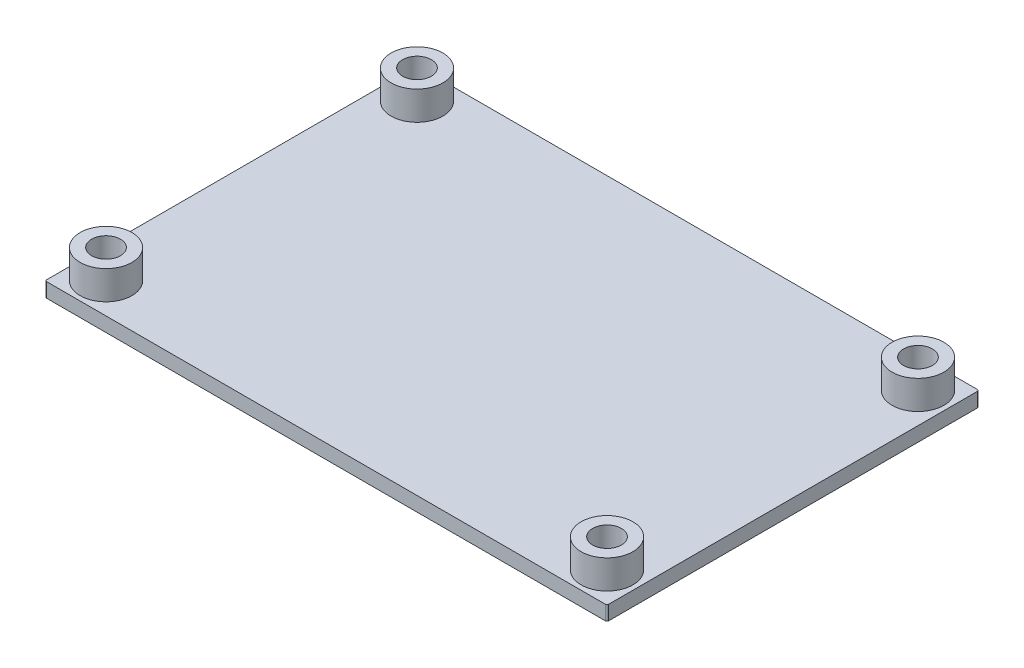
ISO-10303-21;
HEADER;
FILE_DESCRIPTION(('STEP AP214'),'2;1');
FILE_NAME('part.step','',(''),(''),'','','');
FILE_SCHEMA(('AUTOMOTIVE_DESIGN { 1 0 10303 214 1 1 1 1 }'));
ENDSEC;
DATA;
#1=APPLICATION_CONTEXT('core data for automotive mechanical design processes');
#2=APPLICATION_PROTOCOL_DEFINITION('international standard','automotive_design',2000,#1);
#3=PRODUCT_CONTEXT('',#1,'mechanical');
#4=PRODUCT('Part','Part','',(#3));
#5=PRODUCT_RELATED_PRODUCT_CATEGORY('part','',(#4));
#6=PRODUCT_DEFINITION_FORMATION('','',#4);
#7=PRODUCT_DEFINITION_CONTEXT('part definition',#1,'design');
#8=PRODUCT_DEFINITION('design','',#6,#7);
#9=PRODUCT_DEFINITION_SHAPE('','',#8);
#10=(LENGTH_UNIT() NAMED_UNIT(*) SI_UNIT(.MILLI.,.METRE.));
#11=(NAMED_UNIT(*) PLANE_ANGLE_UNIT() SI_UNIT($,.RADIAN.));
#12=(NAMED_UNIT(*) SI_UNIT($,.STERADIAN.) SOLID_ANGLE_UNIT());
#13=UNCERTAINTY_MEASURE_WITH_UNIT(LENGTH_MEASURE(1.E-05),#10,'distance_accuracy_value','');
#14=(GEOMETRIC_REPRESENTATION_CONTEXT(3) GLOBAL_UNCERTAINTY_ASSIGNED_CONTEXT((#13)) GLOBAL_UNIT_ASSIGNED_CONTEXT((#10,
#11,#12)) REPRESENTATION_CONTEXT('',''));
#15=CARTESIAN_POINT('',(0.,0.,0.));
#16=DIRECTION('',(0.,0.,1.));
#17=DIRECTION('',(1.,0.,0.));
#18=AXIS2_PLACEMENT_3D('',#15,#16,#17);
#19=CARTESIAN_POINT('',(8.00000000000001,7.5,-8.));
#20=DIRECTION('',(0.,-1.,0.));
#21=DIRECTION('',(0.,0.,-1.));
#22=AXIS2_PLACEMENT_3D('',#19,#20,#21);
#23=CYLINDRICAL_SURFACE('',#22,4.5);
#24=CARTESIAN_POINT('',(8.00000000000001,2.5,-8.));
#25=DIRECTION('',(0.,1.,0.));
#26=DIRECTION('',(0.,0.,1.));
#27=AXIS2_PLACEMENT_3D('',#24,#25,#26);
#28=CIRCLE('',#27,4.5);
#29=CARTESIAN_POINT('',(8.00000000000001,2.5,-3.5));
#30=VERTEX_POINT('',#29);
#31=EDGE_CURVE('E309',#30,#30,#28,.F.);
#32=ORIENTED_EDGE('',*,*,#31,.F.);
#33=EDGE_LOOP('',(#32));
#34=FACE_BOUND('',#33,.T.);
#35=CARTESIAN_POINT('',(8.00000000000001,7.5,-8.));
#36=DIRECTION('',(0.,1.,0.));
#37=DIRECTION('',(0.,0.,1.));
#38=AXIS2_PLACEMENT_3D('',#35,#36,#37);
#39=CIRCLE('',#38,4.5);
#40=CARTESIAN_POINT('',(8.00000000000001,7.5,-3.5));
#41=VERTEX_POINT('',#40);
#42=EDGE_CURVE('E301',#41,#41,#39,.F.);
#43=ORIENTED_EDGE('',*,*,#42,.T.);
#44=EDGE_LOOP('',(#43));
#45=FACE_BOUND('',#44,.T.);
#46=ADVANCED_FACE('F149',(#34,#45),#23,.T.);
#47=CARTESIAN_POINT('',(8.00000000000001,7.5,-8.));
#48=DIRECTION('',(0.,-1.,0.));
#49=DIRECTION('',(0.,0.,-1.));
#50=AXIS2_PLACEMENT_3D('',#47,#48,#49);
#51=CYLINDRICAL_SURFACE('',#50,2.5);
#52=CARTESIAN_POINT('',(8.00000000000001,2.5,-8.));
#53=DIRECTION('',(0.,1.,0.));
#54=DIRECTION('',(0.,0.,1.));
#55=AXIS2_PLACEMENT_3D('',#52,#53,#54);
#56=CIRCLE('',#55,2.5);
#57=CARTESIAN_POINT('',(8.00000000000001,2.5,-5.50000000000001));
#58=VERTEX_POINT('',#57);
#59=EDGE_CURVE('E330',#58,#58,#56,.F.);
#60=ORIENTED_EDGE('',*,*,#59,.T.);
#61=EDGE_LOOP('',(#60));
#62=FACE_BOUND('',#61,.T.);
#63=CARTESIAN_POINT('',(8.00000000000001,7.5,-8.));
#64=DIRECTION('',(0.,1.,0.));
#65=DIRECTION('',(0.,0.,1.));
#66=AXIS2_PLACEMENT_3D('',#63,#64,#65);
#67=CIRCLE('',#66,2.5);
#68=CARTESIAN_POINT('',(8.00000000000001,7.5,-5.50000000000001));
#69=VERTEX_POINT('',#68);
#70=EDGE_CURVE('E305',#69,#69,#67,.F.);
#71=ORIENTED_EDGE('',*,*,#70,.F.);
#72=EDGE_LOOP('',(#71));
#73=FACE_BOUND('',#72,.T.);
#74=ADVANCED_FACE('F397',(#62,#73),#51,.F.);
#75=CARTESIAN_POINT('',(0.,7.5,0.));
#76=DIRECTION('',(0.,1.,0.));
#77=DIRECTION('',(0.,0.,1.));
#78=AXIS2_PLACEMENT_3D('',#75,#76,#77);
#79=PLANE('',#78);
#80=ORIENTED_EDGE('',*,*,#42,.F.);
#81=EDGE_LOOP('',(#80));
#82=FACE_BOUND('',#81,.T.);
#83=ORIENTED_EDGE('',*,*,#70,.T.);
#84=EDGE_LOOP('',(#83));
#85=FACE_BOUND('',#84,.T.);
#86=ADVANCED_FACE('F402',(#82,#85),#79,.T.);
#87=CARTESIAN_POINT('',(0.,0.,0.));
#88=DIRECTION('',(0.,1.,0.));
#89=DIRECTION('',(0.,0.,1.));
#90=AXIS2_PLACEMENT_3D('',#87,#88,#89);
#91=PLANE('',#90);
#92=DIRECTION('',(1.,0.,0.));
#93=VECTOR('',#92,1.);
#94=CARTESIAN_POINT('',(0.,0.,-2.7));
#95=LINE('',#94,#93);
#96=CARTESIAN_POINT('',(3.,0.,-2.7));
#97=VERTEX_POINT('',#96);
#98=CARTESIAN_POINT('',(100.,0.,-2.7));
#99=VERTEX_POINT('',#98);
#100=EDGE_CURVE('E253',#97,#99,#95,.T.);
#101=ORIENTED_EDGE('',*,*,#100,.F.);
#102=CARTESIAN_POINT('',(3.,0.,-3.));
#103=DIRECTION('',(0.,1.,0.));
#104=DIRECTION('',(0.,0.,1.));
#105=AXIS2_PLACEMENT_3D('',#102,#103,#104);
#106=CIRCLE('',#105,0.299999999999999);
#107=CARTESIAN_POINT('',(2.7,0.,-3.00000000000002));
#108=VERTEX_POINT('',#107);
#109=EDGE_CURVE('E277',#97,#108,#106,.F.);
#110=ORIENTED_EDGE('',*,*,#109,.T.);
#111=DIRECTION('',(0.,0.,-1.));
#112=VECTOR('',#111,1.);
#113=CARTESIAN_POINT('',(2.7,0.,0.));
#114=LINE('',#113,#112);
#115=CARTESIAN_POINT('',(2.7,0.,-67.));
#116=VERTEX_POINT('',#115);
#117=EDGE_CURVE('E274',#108,#116,#114,.T.);
#118=ORIENTED_EDGE('',*,*,#117,.T.);
#119=CARTESIAN_POINT('',(3.,0.,-67.));
#120=DIRECTION('',(0.,1.,0.));
#121=DIRECTION('',(0.,0.,1.));
#122=AXIS2_PLACEMENT_3D('',#119,#120,#121);
#123=CIRCLE('',#122,0.300000000000005);
#124=CARTESIAN_POINT('',(3.00000000000002,0.,-67.3));
#125=VERTEX_POINT('',#124);
#126=EDGE_CURVE('E226',#116,#125,#123,.F.);
#127=ORIENTED_EDGE('',*,*,#126,.T.);
#128=DIRECTION('',(1.,0.,0.));
#129=VECTOR('',#128,1.);
#130=CARTESIAN_POINT('',(0.,0.,-67.3));
#131=LINE('',#130,#129);
#132=CARTESIAN_POINT('',(100.,0.,-67.3));
#133=VERTEX_POINT('',#132);
#134=EDGE_CURVE('E268',#125,#133,#131,.T.);
#135=ORIENTED_EDGE('',*,*,#134,.T.);
#136=CARTESIAN_POINT('',(100.,0.,-67.));
#137=DIRECTION('',(0.,1.,0.));
#138=DIRECTION('',(0.,0.,1.));
#139=AXIS2_PLACEMENT_3D('',#136,#137,#138);
#140=CIRCLE('',#139,0.300000000000009);
#141=CARTESIAN_POINT('',(100.3,0.,-67.));
#142=VERTEX_POINT('',#141);
#143=EDGE_CURVE('E264',#133,#142,#140,.F.);
#144=ORIENTED_EDGE('',*,*,#143,.T.);
#145=DIRECTION('',(0.,0.,-1.));
#146=VECTOR('',#145,1.);
#147=CARTESIAN_POINT('',(100.3,0.,0.));
#148=LINE('',#147,#146);
#149=CARTESIAN_POINT('',(100.3,0.,-3.00000000000002));
#150=VERTEX_POINT('',#149);
#151=EDGE_CURVE('E260',#150,#142,#148,.T.);
#152=ORIENTED_EDGE('',*,*,#151,.F.);
#153=CARTESIAN_POINT('',(100.,0.,-3.));
#154=DIRECTION('',(0.,1.,0.));
#155=DIRECTION('',(0.,0.,1.));
#156=AXIS2_PLACEMENT_3D('',#153,#154,#155);
#157=CIRCLE('',#156,0.300000000000004);
#158=EDGE_CURVE('E256',#99,#150,#157,.T.);
#159=ORIENTED_EDGE('',*,*,#158,.F.);
#160=EDGE_LOOP('',(#101,#110,#118,#127,#135,#144,#152,#159));
#161=FACE_BOUND('',#160,.T.);
#162=ADVANCED_FACE('F384',(#161),#91,.F.);
#163=CARTESIAN_POINT('',(0.,2.5,-2.7));
#164=DIRECTION('',(0.,0.,-1.));
#165=DIRECTION('',(-1.,0.,0.));
#166=AXIS2_PLACEMENT_3D('',#163,#164,#165);
#167=PLANE('',#166);
#168=ORIENTED_EDGE('',*,*,#100,.T.);
#169=DIRECTION('',(0.,-1.,0.));
#170=VECTOR('',#169,1.);
#171=CARTESIAN_POINT('',(100.,2.5,-2.7));
#172=LINE('',#171,#170);
#173=CARTESIAN_POINT('',(100.,2.5,-2.7));
#174=VERTEX_POINT('',#173);
#175=EDGE_CURVE('E298',#174,#99,#172,.T.);
#176=ORIENTED_EDGE('',*,*,#175,.F.);
#177=DIRECTION('',(1.,0.,0.));
#178=VECTOR('',#177,1.);
#179=CARTESIAN_POINT('',(0.,2.5,-2.7));
#180=LINE('',#179,#178);
#181=CARTESIAN_POINT('',(3.,2.5,-2.7));
#182=VERTEX_POINT('',#181);
#183=EDGE_CURVE('E367',#182,#174,#180,.T.);
#184=ORIENTED_EDGE('',*,*,#183,.F.);
#185=DIRECTION('',(0.,-1.,0.));
#186=VECTOR('',#185,1.);
#187=CARTESIAN_POINT('',(3.,2.5,-2.7));
#188=LINE('',#187,#186);
#189=EDGE_CURVE('E166',#182,#97,#188,.T.);
#190=ORIENTED_EDGE('',*,*,#189,.T.);
#191=EDGE_LOOP('',(#168,#176,#184,#190));
#192=FACE_BOUND('',#191,.T.);
#193=ADVANCED_FACE('F416',(#192),#167,.F.);
#194=CARTESIAN_POINT('',(100.,2.5,-3.));
#195=DIRECTION('',(0.,-1.,0.));
#196=DIRECTION('',(0.,0.,-1.));
#197=AXIS2_PLACEMENT_3D('',#194,#195,#196);
#198=CYLINDRICAL_SURFACE('',#197,0.300000000000004);
#199=ORIENTED_EDGE('',*,*,#158,.T.);
#200=DIRECTION('',(0.,-1.,0.));
#201=VECTOR('',#200,1.);
#202=CARTESIAN_POINT('',(100.3,2.5,-3.00000000000002));
#203=LINE('',#202,#201);
#204=CARTESIAN_POINT('',(100.3,2.5,-3.00000000000002));
#205=VERTEX_POINT('',#204);
#206=EDGE_CURVE('E294',#205,#150,#203,.T.);
#207=ORIENTED_EDGE('',*,*,#206,.F.);
#208=CARTESIAN_POINT('',(100.,2.5,-3.));
#209=DIRECTION('',(0.,1.,0.));
#210=DIRECTION('',(0.,0.,1.));
#211=AXIS2_PLACEMENT_3D('',#208,#209,#210);
#212=CIRCLE('',#211,0.300000000000004);
#213=EDGE_CURVE('E205',#174,#205,#212,.T.);
#214=ORIENTED_EDGE('',*,*,#213,.F.);
#215=ORIENTED_EDGE('',*,*,#175,.T.);
#216=EDGE_LOOP('',(#199,#207,#214,#215));
#217=FACE_BOUND('',#216,.T.);
#218=ADVANCED_FACE('F421',(#217),#198,.T.);
#219=CARTESIAN_POINT('',(100.3,2.5,0.));
#220=DIRECTION('',(-1.,0.,0.));
#221=DIRECTION('',(0.,0.,1.));
#222=AXIS2_PLACEMENT_3D('',#219,#220,#221);
#223=PLANE('',#222);
#224=ORIENTED_EDGE('',*,*,#151,.T.);
#225=DIRECTION('',(0.,-1.,0.));
#226=VECTOR('',#225,1.);
#227=CARTESIAN_POINT('',(100.3,2.5,-67.));
#228=LINE('',#227,#226);
#229=CARTESIAN_POINT('',(100.3,2.5,-67.));
#230=VERTEX_POINT('',#229);
#231=EDGE_CURVE('E291',#230,#142,#228,.T.);
#232=ORIENTED_EDGE('',*,*,#231,.F.);
#233=DIRECTION('',(0.,0.,-1.));
#234=VECTOR('',#233,1.);
#235=CARTESIAN_POINT('',(100.3,2.5,0.));
#236=LINE('',#235,#234);
#237=EDGE_CURVE('E372',#205,#230,#236,.T.);
#238=ORIENTED_EDGE('',*,*,#237,.F.);
#239=ORIENTED_EDGE('',*,*,#206,.T.);
#240=EDGE_LOOP('',(#224,#232,#238,#239));
#241=FACE_BOUND('',#240,.T.);
#242=ADVANCED_FACE('F424',(#241),#223,.F.);
#243=CARTESIAN_POINT('',(100.,2.5,-67.));
#244=DIRECTION('',(0.,-1.,0.));
#245=DIRECTION('',(0.,0.,-1.));
#246=AXIS2_PLACEMENT_3D('',#243,#244,#245);
#247=CYLINDRICAL_SURFACE('',#246,0.300000000000009);
#248=ORIENTED_EDGE('',*,*,#143,.F.);
#249=DIRECTION('',(0.,-1.,0.));
#250=VECTOR('',#249,1.);
#251=CARTESIAN_POINT('',(100.,2.5,-67.3));
#252=LINE('',#251,#250);
#253=CARTESIAN_POINT('',(100.,2.5,-67.3));
#254=VERTEX_POINT('',#253);
#255=EDGE_CURVE('E288',#254,#133,#252,.T.);
#256=ORIENTED_EDGE('',*,*,#255,.F.);
#257=CARTESIAN_POINT('',(100.,2.5,-67.));
#258=DIRECTION('',(0.,1.,0.));
#259=DIRECTION('',(0.,0.,1.));
#260=AXIS2_PLACEMENT_3D('',#257,#258,#259);
#261=CIRCLE('',#260,0.300000000000009);
#262=EDGE_CURVE('E375',#254,#230,#261,.F.);
#263=ORIENTED_EDGE('',*,*,#262,.T.);
#264=ORIENTED_EDGE('',*,*,#231,.T.);
#265=EDGE_LOOP('',(#248,#256,#263,#264));
#266=FACE_BOUND('',#265,.T.);
#267=ADVANCED_FACE('F427',(#266),#247,.T.);
#268=CARTESIAN_POINT('',(0.,2.5,-67.3));
#269=DIRECTION('',(0.,0.,-1.));
#270=DIRECTION('',(-1.,0.,0.));
#271=AXIS2_PLACEMENT_3D('',#268,#269,#270);
#272=PLANE('',#271);
#273=ORIENTED_EDGE('',*,*,#134,.F.);
#274=DIRECTION('',(0.,-1.,0.));
#275=VECTOR('',#274,1.);
#276=CARTESIAN_POINT('',(3.00000000000002,2.5,-67.3));
#277=LINE('',#276,#275);
#278=CARTESIAN_POINT('',(3.00000000000002,2.5,-67.3));
#279=VERTEX_POINT('',#278);
#280=EDGE_CURVE('E231',#279,#125,#277,.T.);
#281=ORIENTED_EDGE('',*,*,#280,.F.);
#282=DIRECTION('',(1.,0.,0.));
#283=VECTOR('',#282,1.);
#284=CARTESIAN_POINT('',(0.,2.5,-67.3));
#285=LINE('',#284,#283);
#286=EDGE_CURVE('E242',#279,#254,#285,.T.);
#287=ORIENTED_EDGE('',*,*,#286,.T.);
#288=ORIENTED_EDGE('',*,*,#255,.T.);
#289=EDGE_LOOP('',(#273,#281,#287,#288));
#290=FACE_BOUND('',#289,.T.);
#291=ADVANCED_FACE('F381',(#290),#272,.T.);
#292=CARTESIAN_POINT('',(3.,2.5,-67.));
#293=DIRECTION('',(0.,-1.,0.));
#294=DIRECTION('',(0.,0.,-1.));
#295=AXIS2_PLACEMENT_3D('',#292,#293,#294);
#296=CYLINDRICAL_SURFACE('',#295,0.300000000000005);
#297=ORIENTED_EDGE('',*,*,#126,.F.);
#298=DIRECTION('',(0.,-1.,0.));
#299=VECTOR('',#298,1.);
#300=CARTESIAN_POINT('',(2.7,2.5,-67.));
#301=LINE('',#300,#299);
#302=CARTESIAN_POINT('',(2.7,2.5,-67.));
#303=VERTEX_POINT('',#302);
#304=EDGE_CURVE('E221',#303,#116,#301,.T.);
#305=ORIENTED_EDGE('',*,*,#304,.F.);
#306=CARTESIAN_POINT('',(3.,2.5,-67.));
#307=DIRECTION('',(0.,1.,0.));
#308=DIRECTION('',(0.,0.,1.));
#309=AXIS2_PLACEMENT_3D('',#306,#307,#308);
#310=CIRCLE('',#309,0.300000000000005);
#311=EDGE_CURVE('E224',#303,#279,#310,.F.);
#312=ORIENTED_EDGE('',*,*,#311,.T.);
#313=ORIENTED_EDGE('',*,*,#280,.T.);
#314=EDGE_LOOP('',(#297,#305,#312,#313));
#315=FACE_BOUND('',#314,.T.);
#316=ADVANCED_FACE('F223',(#315),#296,.T.);
#317=CARTESIAN_POINT('',(2.7,2.5,0.));
#318=DIRECTION('',(-1.,0.,0.));
#319=DIRECTION('',(0.,0.,1.));
#320=AXIS2_PLACEMENT_3D('',#317,#318,#319);
#321=PLANE('',#320);
#322=ORIENTED_EDGE('',*,*,#117,.F.);
#323=DIRECTION('',(0.,-1.,0.));
#324=VECTOR('',#323,1.);
#325=CARTESIAN_POINT('',(2.7,2.5,-3.00000000000002));
#326=LINE('',#325,#324);
#327=CARTESIAN_POINT('',(2.7,2.5,-3.00000000000002));
#328=VERTEX_POINT('',#327);
#329=EDGE_CURVE('E192',#328,#108,#326,.T.);
#330=ORIENTED_EDGE('',*,*,#329,.F.);
#331=DIRECTION('',(0.,0.,-1.));
#332=VECTOR('',#331,1.);
#333=CARTESIAN_POINT('',(2.7,2.5,0.));
#334=LINE('',#333,#332);
#335=EDGE_CURVE('E239',#328,#303,#334,.T.);
#336=ORIENTED_EDGE('',*,*,#335,.T.);
#337=ORIENTED_EDGE('',*,*,#304,.T.);
#338=EDGE_LOOP('',(#322,#330,#336,#337));
#339=FACE_BOUND('',#338,.T.);
#340=ADVANCED_FACE('F245',(#339),#321,.T.);
#341=CARTESIAN_POINT('',(3.,2.5,-3.));
#342=DIRECTION('',(0.,-1.,0.));
#343=DIRECTION('',(0.,0.,-1.));
#344=AXIS2_PLACEMENT_3D('',#341,#342,#343);
#345=CYLINDRICAL_SURFACE('',#344,0.299999999999999);
#346=ORIENTED_EDGE('',*,*,#109,.F.);
#347=ORIENTED_EDGE('',*,*,#189,.F.);
#348=CARTESIAN_POINT('',(3.,2.5,-3.));
#349=DIRECTION('',(0.,1.,0.));
#350=DIRECTION('',(0.,0.,1.));
#351=AXIS2_PLACEMENT_3D('',#348,#349,#350);
#352=CIRCLE('',#351,0.299999999999999);
#353=EDGE_CURVE('E247',#182,#328,#352,.F.);
#354=ORIENTED_EDGE('',*,*,#353,.T.);
#355=ORIENTED_EDGE('',*,*,#329,.T.);
#356=EDGE_LOOP('',(#346,#347,#354,#355));
#357=FACE_BOUND('',#356,.T.);
#358=ADVANCED_FACE('F385',(#357),#345,.T.);
#359=CARTESIAN_POINT('',(0.,2.5,0.));
#360=DIRECTION('',(0.,1.,0.));
#361=DIRECTION('',(0.,0.,1.));
#362=AXIS2_PLACEMENT_3D('',#359,#360,#361);
#363=PLANE('',#362);
#364=CARTESIAN_POINT('',(8.00000000000001,2.5,-62.));
#365=DIRECTION('',(0.,1.,0.));
#366=DIRECTION('',(0.,0.,1.));
#367=AXIS2_PLACEMENT_3D('',#364,#365,#366);
#368=CIRCLE('',#367,4.50000000000001);
#369=CARTESIAN_POINT('',(8.00000000000001,2.5,-57.5));
#370=VERTEX_POINT('',#369);
#371=EDGE_CURVE('E281',#370,#370,#368,.T.);
#372=ORIENTED_EDGE('',*,*,#371,.F.);
#373=EDGE_LOOP('',(#372));
#374=FACE_BOUND('',#373,.T.);
#375=CARTESIAN_POINT('',(95.,2.5,-8.));
#376=DIRECTION('',(0.,1.,0.));
#377=DIRECTION('',(0.,0.,1.));
#378=AXIS2_PLACEMENT_3D('',#375,#376,#377);
#379=CIRCLE('',#378,4.5);
#380=CARTESIAN_POINT('',(95.,2.5,-3.5));
#381=VERTEX_POINT('',#380);
#382=EDGE_CURVE('E363',#381,#381,#379,.T.);
#383=ORIENTED_EDGE('',*,*,#382,.F.);
#384=EDGE_LOOP('',(#383));
#385=FACE_BOUND('',#384,.T.);
#386=ORIENTED_EDGE('',*,*,#183,.T.);
#387=ORIENTED_EDGE('',*,*,#213,.T.);
#388=ORIENTED_EDGE('',*,*,#237,.T.);
#389=ORIENTED_EDGE('',*,*,#262,.F.);
#390=ORIENTED_EDGE('',*,*,#286,.F.);
#391=ORIENTED_EDGE('',*,*,#311,.F.);
#392=ORIENTED_EDGE('',*,*,#335,.F.);
#393=ORIENTED_EDGE('',*,*,#353,.F.);
#394=EDGE_LOOP('',(#386,#387,#388,#389,#390,#391,#392,#393));
#395=FACE_BOUND('',#394,.T.);
#396=CARTESIAN_POINT('',(95.,2.5,-62.));
#397=DIRECTION('',(0.,1.,0.));
#398=DIRECTION('',(0.,0.,1.));
#399=AXIS2_PLACEMENT_3D('',#396,#397,#398);
#400=CIRCLE('',#399,4.50000000000001);
#401=CARTESIAN_POINT('',(95.,2.5,-57.5));
#402=VERTEX_POINT('',#401);
#403=EDGE_CURVE('E349',#402,#402,#400,.T.);
#404=ORIENTED_EDGE('',*,*,#403,.F.);
#405=EDGE_LOOP('',(#404));
#406=FACE_BOUND('',#405,.T.);
#407=ORIENTED_EDGE('',*,*,#31,.T.);
#408=EDGE_LOOP('',(#407));
#409=FACE_BOUND('',#408,.T.);
#410=ADVANCED_FACE('F236',(#374,#385,#395,#406,#409),#363,.T.);
#411=CARTESIAN_POINT('',(95.,7.5,-8.));
#412=DIRECTION('',(0.,-1.,0.));
#413=DIRECTION('',(0.,0.,-1.));
#414=AXIS2_PLACEMENT_3D('',#411,#412,#413);
#415=CYLINDRICAL_SURFACE('',#414,2.5);
#416=CARTESIAN_POINT('',(95.,2.5,-8.));
#417=DIRECTION('',(0.,1.,0.));
#418=DIRECTION('',(0.,0.,1.));
#419=AXIS2_PLACEMENT_3D('',#416,#417,#418);
#420=CIRCLE('',#419,2.5);
#421=CARTESIAN_POINT('',(95.,2.5,-5.50000000000001));
#422=VERTEX_POINT('',#421);
#423=EDGE_CURVE('E12',#422,#422,#420,.T.);
#424=ORIENTED_EDGE('',*,*,#423,.F.);
#425=EDGE_LOOP('',(#424));
#426=FACE_BOUND('',#425,.T.);
#427=CARTESIAN_POINT('',(95.,7.5,-8.));
#428=DIRECTION('',(0.,1.,0.));
#429=DIRECTION('',(0.,0.,1.));
#430=AXIS2_PLACEMENT_3D('',#427,#428,#429);
#431=CIRCLE('',#430,2.5);
#432=CARTESIAN_POINT('',(95.,7.5,-5.50000000000001));
#433=VERTEX_POINT('',#432);
#434=EDGE_CURVE('E353',#433,#433,#431,.T.);
#435=ORIENTED_EDGE('',*,*,#434,.T.);
#436=EDGE_LOOP('',(#435));
#437=FACE_BOUND('',#436,.T.);
#438=ADVANCED_FACE('F392',(#426,#437),#415,.F.);
#439=CARTESIAN_POINT('',(95.,7.5,-8.));
#440=DIRECTION('',(0.,-1.,0.));
#441=DIRECTION('',(0.,0.,-1.));
#442=AXIS2_PLACEMENT_3D('',#439,#440,#441);
#443=CYLINDRICAL_SURFACE('',#442,4.5);
#444=ORIENTED_EDGE('',*,*,#382,.T.);
#445=EDGE_LOOP('',(#444));
#446=FACE_BOUND('',#445,.T.);
#447=CARTESIAN_POINT('',(95.,7.5,-8.));
#448=DIRECTION('',(0.,1.,0.));
#449=DIRECTION('',(0.,0.,1.));
#450=AXIS2_PLACEMENT_3D('',#447,#448,#449);
#451=CIRCLE('',#450,4.5);
#452=CARTESIAN_POINT('',(95.,7.5,-3.5));
#453=VERTEX_POINT('',#452);
#454=EDGE_CURVE('E257',#453,#453,#451,.T.);
#455=ORIENTED_EDGE('',*,*,#454,.F.);
#456=EDGE_LOOP('',(#455));
#457=FACE_BOUND('',#456,.T.);
#458=ADVANCED_FACE('F463',(#446,#457),#443,.T.);
#459=CARTESIAN_POINT('',(0.,7.5,0.));
#460=DIRECTION('',(0.,1.,0.));
#461=DIRECTION('',(0.,0.,1.));
#462=AXIS2_PLACEMENT_3D('',#459,#460,#461);
#463=PLANE('',#462);
#464=ORIENTED_EDGE('',*,*,#434,.F.);
#465=EDGE_LOOP('',(#464));
#466=FACE_BOUND('',#465,.T.);
#467=ORIENTED_EDGE('',*,*,#454,.T.);
#468=EDGE_LOOP('',(#467));
#469=FACE_BOUND('',#468,.T.);
#470=ADVANCED_FACE('F474',(#466,#469),#463,.T.);
#471=CARTESIAN_POINT('',(95.,7.5,-62.));
#472=DIRECTION('',(0.,-1.,0.));
#473=DIRECTION('',(0.,0.,-1.));
#474=AXIS2_PLACEMENT_3D('',#471,#472,#473);
#475=CYLINDRICAL_SURFACE('',#474,4.50000000000001);
#476=ORIENTED_EDGE('',*,*,#403,.T.);
#477=EDGE_LOOP('',(#476));
#478=FACE_BOUND('',#477,.T.);
#479=CARTESIAN_POINT('',(95.,7.5,-62.));
#480=DIRECTION('',(0.,1.,0.));
#481=DIRECTION('',(0.,0.,1.));
#482=AXIS2_PLACEMENT_3D('',#479,#480,#481);
#483=CIRCLE('',#482,4.50000000000001);
#484=CARTESIAN_POINT('',(95.,7.5,-57.5));
#485=VERTEX_POINT('',#484);
#486=EDGE_CURVE('E335',#485,#485,#483,.F.);
#487=ORIENTED_EDGE('',*,*,#486,.T.);
#488=EDGE_LOOP('',(#487));
#489=FACE_BOUND('',#488,.T.);
#490=ADVANCED_FACE('F484',(#478,#489),#475,.T.);
#491=CARTESIAN_POINT('',(95.,7.5,-62.));
#492=DIRECTION('',(0.,-1.,0.));
#493=DIRECTION('',(0.,0.,-1.));
#494=AXIS2_PLACEMENT_3D('',#491,#492,#493);
#495=CYLINDRICAL_SURFACE('',#494,2.5);
#496=CARTESIAN_POINT('',(95.,2.5,-62.));
#497=DIRECTION('',(0.,1.,0.));
#498=DIRECTION('',(0.,0.,1.));
#499=AXIS2_PLACEMENT_3D('',#496,#497,#498);
#500=CIRCLE('',#499,2.5);
#501=CARTESIAN_POINT('',(95.,2.5,-59.5));
#502=VERTEX_POINT('',#501);
#503=EDGE_CURVE('E338',#502,#502,#500,.F.);
#504=ORIENTED_EDGE('',*,*,#503,.T.);
#505=EDGE_LOOP('',(#504));
#506=FACE_BOUND('',#505,.T.);
#507=CARTESIAN_POINT('',(95.,7.5,-62.));
#508=DIRECTION('',(0.,1.,0.));
#509=DIRECTION('',(0.,0.,1.));
#510=AXIS2_PLACEMENT_3D('',#507,#508,#509);
#511=CIRCLE('',#510,2.5);
#512=CARTESIAN_POINT('',(95.,7.5,-59.5));
#513=VERTEX_POINT('',#512);
#514=EDGE_CURVE('E345',#513,#513,#511,.F.);
#515=ORIENTED_EDGE('',*,*,#514,.F.);
#516=EDGE_LOOP('',(#515));
#517=FACE_BOUND('',#516,.T.);
#518=ADVANCED_FACE('F495',(#506,#517),#495,.F.);
#519=CARTESIAN_POINT('',(0.,7.5,0.));
#520=DIRECTION('',(0.,1.,0.));
#521=DIRECTION('',(0.,0.,1.));
#522=AXIS2_PLACEMENT_3D('',#519,#520,#521);
#523=PLANE('',#522);
#524=ORIENTED_EDGE('',*,*,#486,.F.);
#525=EDGE_LOOP('',(#524));
#526=FACE_BOUND('',#525,.T.);
#527=ORIENTED_EDGE('',*,*,#514,.T.);
#528=EDGE_LOOP('',(#527));
#529=FACE_BOUND('',#528,.T.);
#530=ADVANCED_FACE('F322',(#526,#529),#523,.T.);
#531=CARTESIAN_POINT('',(8.00000000000001,7.5,-62.));
#532=DIRECTION('',(0.,-1.,0.));
#533=DIRECTION('',(0.,0.,-1.));
#534=AXIS2_PLACEMENT_3D('',#531,#532,#533);
#535=CYLINDRICAL_SURFACE('',#534,2.5);
#536=CARTESIAN_POINT('',(8.00000000000001,2.5,-62.));
#537=DIRECTION('',(0.,1.,0.));
#538=DIRECTION('',(0.,0.,1.));
#539=AXIS2_PLACEMENT_3D('',#536,#537,#538);
#540=CIRCLE('',#539,2.5);
#541=CARTESIAN_POINT('',(8.00000000000001,2.5,-59.5));
#542=VERTEX_POINT('',#541);
#543=EDGE_CURVE('E158',#542,#542,#540,.T.);
#544=ORIENTED_EDGE('',*,*,#543,.F.);
#545=EDGE_LOOP('',(#544));
#546=FACE_BOUND('',#545,.T.);
#547=CARTESIAN_POINT('',(8.00000000000001,7.5,-62.));
#548=DIRECTION('',(0.,1.,0.));
#549=DIRECTION('',(0.,0.,1.));
#550=AXIS2_PLACEMENT_3D('',#547,#548,#549);
#551=CIRCLE('',#550,2.5);
#552=CARTESIAN_POINT('',(8.00000000000001,7.5,-59.5));
#553=VERTEX_POINT('',#552);
#554=EDGE_CURVE('E326',#553,#553,#551,.T.);
#555=ORIENTED_EDGE('',*,*,#554,.T.);
#556=EDGE_LOOP('',(#555));
#557=FACE_BOUND('',#556,.T.);
#558=ADVANCED_FACE('F318',(#546,#557),#535,.F.);
#559=CARTESIAN_POINT('',(8.00000000000001,7.5,-62.));
#560=DIRECTION('',(0.,-1.,0.));
#561=DIRECTION('',(0.,0.,-1.));
#562=AXIS2_PLACEMENT_3D('',#559,#560,#561);
#563=CYLINDRICAL_SURFACE('',#562,4.50000000000001);
#564=ORIENTED_EDGE('',*,*,#371,.T.);
#565=EDGE_LOOP('',(#564));
#566=FACE_BOUND('',#565,.T.);
#567=CARTESIAN_POINT('',(8.00000000000001,7.5,-62.));
#568=DIRECTION('',(0.,1.,0.));
#569=DIRECTION('',(0.,0.,1.));
#570=AXIS2_PLACEMENT_3D('',#567,#568,#569);
#571=CIRCLE('',#570,4.50000000000001);
#572=CARTESIAN_POINT('',(8.00000000000001,7.5,-57.5));
#573=VERTEX_POINT('',#572);
#574=EDGE_CURVE('E329',#573,#573,#571,.T.);
#575=ORIENTED_EDGE('',*,*,#574,.F.);
#576=EDGE_LOOP('',(#575));
#577=FACE_BOUND('',#576,.T.);
#578=ADVANCED_FACE('F321',(#566,#577),#563,.T.);
#579=CARTESIAN_POINT('',(0.,7.5,0.));
#580=DIRECTION('',(0.,1.,0.));
#581=DIRECTION('',(0.,0.,1.));
#582=AXIS2_PLACEMENT_3D('',#579,#580,#581);
#583=PLANE('',#582);
#584=ORIENTED_EDGE('',*,*,#554,.F.);
#585=EDGE_LOOP('',(#584));
#586=FACE_BOUND('',#585,.T.);
#587=ORIENTED_EDGE('',*,*,#574,.T.);
#588=EDGE_LOOP('',(#587));
#589=FACE_BOUND('',#588,.T.);
#590=ADVANCED_FACE('F530',(#586,#589),#583,.T.);
#591=CARTESIAN_POINT('',(0.,2.5,0.));
#592=DIRECTION('',(0.,1.,0.));
#593=DIRECTION('',(0.,0.,1.));
#594=AXIS2_PLACEMENT_3D('',#591,#592,#593);
#595=PLANE('',#594);
#596=ORIENTED_EDGE('',*,*,#59,.F.);
#597=EDGE_LOOP('',(#596));
#598=FACE_BOUND('',#597,.T.);
#599=ADVANCED_FACE('F540',(#598),#595,.T.);
#600=CARTESIAN_POINT('',(0.,2.5,0.));
#601=DIRECTION('',(0.,1.,0.));
#602=DIRECTION('',(0.,0.,1.));
#603=AXIS2_PLACEMENT_3D('',#600,#601,#602);
#604=PLANE('',#603);
#605=ORIENTED_EDGE('',*,*,#543,.T.);
#606=EDGE_LOOP('',(#605));
#607=FACE_BOUND('',#606,.T.);
#608=ADVANCED_FACE('F316',(#607),#604,.T.);
#609=CARTESIAN_POINT('',(0.,2.5,0.));
#610=DIRECTION('',(0.,1.,0.));
#611=DIRECTION('',(0.,0.,1.));
#612=AXIS2_PLACEMENT_3D('',#609,#610,#611);
#613=PLANE('',#612);
#614=ORIENTED_EDGE('',*,*,#423,.T.);
#615=EDGE_LOOP('',(#614));
#616=FACE_BOUND('',#615,.T.);
#617=ADVANCED_FACE('F558',(#616),#613,.T.);
#618=CARTESIAN_POINT('',(0.,2.5,0.));
#619=DIRECTION('',(0.,1.,0.));
#620=DIRECTION('',(0.,0.,1.));
#621=AXIS2_PLACEMENT_3D('',#618,#619,#620);
#622=PLANE('',#621);
#623=ORIENTED_EDGE('',*,*,#503,.F.);
#624=EDGE_LOOP('',(#623));
#625=FACE_BOUND('',#624,.T.);
#626=ADVANCED_FACE('F567',(#625),#622,.T.);
#627=CLOSED_SHELL('',(#46,#74,#86,#162,#193,#218,#242,#267,#291,#316,#340,#358,#410,#438,#458,
#470,#490,#518,#530,#558,#578,#590,#599,#608,#617,#626));
#628=MANIFOLD_SOLID_BREP('B2',#627);
#629=ADVANCED_BREP_SHAPE_REPRESENTATION('',(#18,#628),#14);
#630=SHAPE_DEFINITION_REPRESENTATION(#9,#629);
ENDSEC;
END-ISO-10303-21;
